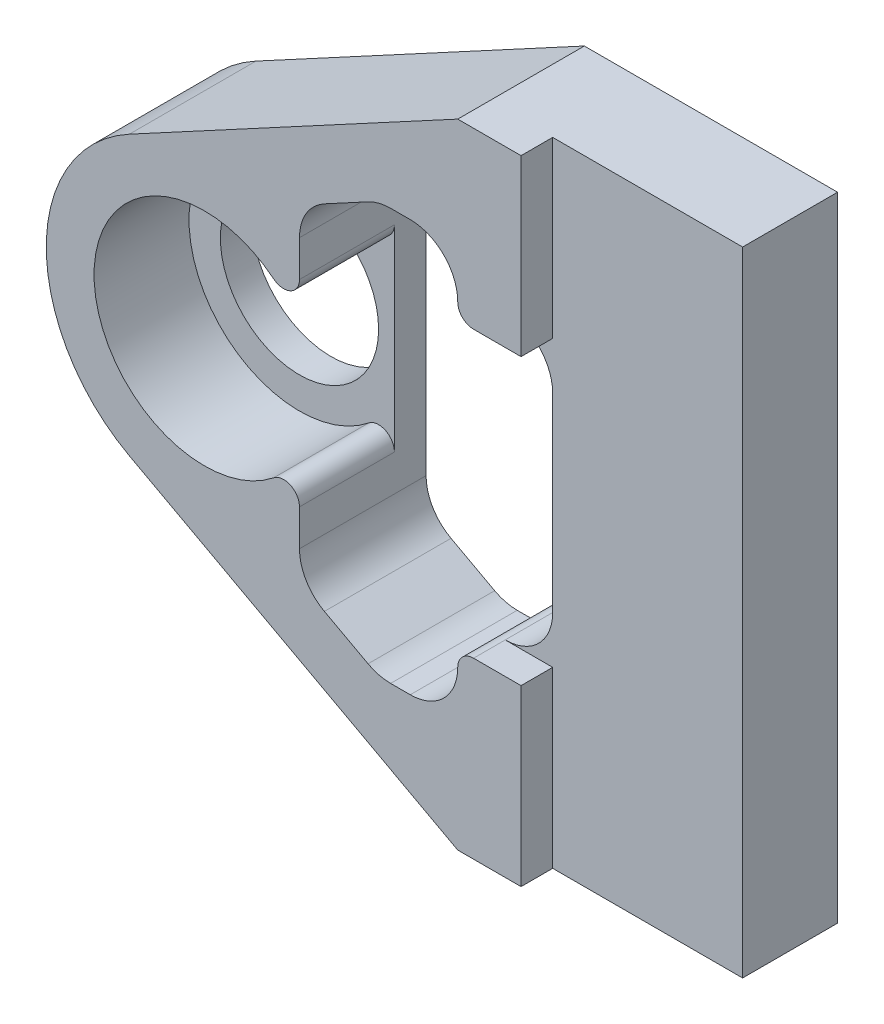
ISO-10303-21;
HEADER;
FILE_DESCRIPTION(('STEP AP214'),'2;1');
FILE_NAME('part.step','',(''),(''),'','','');
FILE_SCHEMA(('AUTOMOTIVE_DESIGN { 1 0 10303 214 1 1 1 1 }'));
ENDSEC;
DATA;
#1=APPLICATION_CONTEXT('core data for automotive mechanical design processes');
#2=APPLICATION_PROTOCOL_DEFINITION('international standard','automotive_design',2000,#1);
#3=PRODUCT_CONTEXT('',#1,'mechanical');
#4=PRODUCT('Part','Part','',(#3));
#5=PRODUCT_RELATED_PRODUCT_CATEGORY('part','',(#4));
#6=PRODUCT_DEFINITION_FORMATION('','',#4);
#7=PRODUCT_DEFINITION_CONTEXT('part definition',#1,'design');
#8=PRODUCT_DEFINITION('design','',#6,#7);
#9=PRODUCT_DEFINITION_SHAPE('','',#8);
#10=(LENGTH_UNIT() NAMED_UNIT(*) SI_UNIT(.MILLI.,.METRE.));
#11=(NAMED_UNIT(*) PLANE_ANGLE_UNIT() SI_UNIT($,.RADIAN.));
#12=(NAMED_UNIT(*) SI_UNIT($,.STERADIAN.) SOLID_ANGLE_UNIT());
#13=UNCERTAINTY_MEASURE_WITH_UNIT(LENGTH_MEASURE(1.E-05),#10,'distance_accuracy_value','');
#14=(GEOMETRIC_REPRESENTATION_CONTEXT(3) GLOBAL_UNCERTAINTY_ASSIGNED_CONTEXT((#13)) GLOBAL_UNIT_ASSIGNED_CONTEXT((#10,
#11,#12)) REPRESENTATION_CONTEXT('',''));
#15=CARTESIAN_POINT('',(0.,0.,0.));
#16=DIRECTION('',(0.,0.,1.));
#17=DIRECTION('',(1.,0.,0.));
#18=AXIS2_PLACEMENT_3D('',#15,#16,#17);
#19=CARTESIAN_POINT('',(10.,10.,3.));
#20=DIRECTION('',(-1.,0.,0.));
#21=DIRECTION('',(0.,-1.,0.));
#22=AXIS2_PLACEMENT_3D('',#19,#20,#21);
#23=PLANE('',#22);
#24=DIRECTION('',(0.,-1.,0.));
#25=VECTOR('',#24,1.);
#26=CARTESIAN_POINT('',(10.,10.,4.));
#27=LINE('',#26,#25);
#28=CARTESIAN_POINT('',(10.,10.,4.));
#29=VERTEX_POINT('',#28);
#30=CARTESIAN_POINT('',(10.,4.5,4.));
#31=VERTEX_POINT('',#30);
#32=EDGE_CURVE('E257',#29,#31,#27,.T.);
#33=ORIENTED_EDGE('',*,*,#32,.T.);
#34=DIRECTION('',(0.,0.,1.));
#35=VECTOR('',#34,1.);
#36=CARTESIAN_POINT('',(10.,4.5,-0.00100000000000013));
#37=LINE('',#36,#35);
#38=CARTESIAN_POINT('',(10.,4.5,3.));
#39=VERTEX_POINT('',#38);
#40=EDGE_CURVE('E250',#39,#31,#37,.T.);
#41=ORIENTED_EDGE('',*,*,#40,.F.);
#42=DIRECTION('',(0.,-1.,0.));
#43=VECTOR('',#42,1.);
#44=CARTESIAN_POINT('',(10.,10.,3.));
#45=LINE('',#44,#43);
#46=CARTESIAN_POINT('',(10.,10.,3.));
#47=VERTEX_POINT('',#46);
#48=EDGE_CURVE('E488',#47,#39,#45,.T.);
#49=ORIENTED_EDGE('',*,*,#48,.F.);
#50=DIRECTION('',(0.,0.,1.));
#51=VECTOR('',#50,1.);
#52=CARTESIAN_POINT('',(10.,10.,3.));
#53=LINE('',#52,#51);
#54=EDGE_CURVE('E271',#47,#29,#53,.T.);
#55=ORIENTED_EDGE('',*,*,#54,.T.);
#56=EDGE_LOOP('',(#33,#41,#49,#55));
#57=FACE_BOUND('',#56,.T.);
#58=ADVANCED_FACE('F33',(#57),#23,.F.);
#59=CARTESIAN_POINT('',(0.,0.,4.));
#60=DIRECTION('',(0.,0.,-1.));
#61=DIRECTION('',(-1.,0.,0.));
#62=AXIS2_PLACEMENT_3D('',#59,#60,#61);
#63=CYLINDRICAL_SURFACE('',#62,2.5);
#64=CARTESIAN_POINT('',(0.,0.,0.));
#65=DIRECTION('',(0.,0.,1.));
#66=DIRECTION('',(1.,0.,0.));
#67=AXIS2_PLACEMENT_3D('',#64,#65,#66);
#68=CIRCLE('',#67,2.5);
#69=CARTESIAN_POINT('',(2.5,0.,0.));
#70=VERTEX_POINT('',#69);
#71=EDGE_CURVE('E279',#70,#70,#68,.T.);
#72=ORIENTED_EDGE('',*,*,#71,.F.);
#73=EDGE_LOOP('',(#72));
#74=FACE_BOUND('',#73,.T.);
#75=CARTESIAN_POINT('',(0.,0.,1.));
#76=DIRECTION('',(0.,0.,1.));
#77=DIRECTION('',(1.,0.,0.));
#78=AXIS2_PLACEMENT_3D('',#75,#76,#77);
#79=CIRCLE('',#78,2.5);
#80=CARTESIAN_POINT('',(2.5,0.,1.));
#81=VERTEX_POINT('',#80);
#82=EDGE_CURVE('E276',#81,#81,#79,.T.);
#83=ORIENTED_EDGE('',*,*,#82,.T.);
#84=EDGE_LOOP('',(#83));
#85=FACE_BOUND('',#84,.T.);
#86=ADVANCED_FACE('F579',(#74,#85),#63,.F.);
#87=CARTESIAN_POINT('',(0.,0.,4.));
#88=DIRECTION('',(0.,0.,1.));
#89=DIRECTION('',(1.,0.,0.));
#90=AXIS2_PLACEMENT_3D('',#87,#88,#89);
#91=PLANE('',#90);
#92=DIRECTION('',(1.,0.,0.));
#93=VECTOR('',#92,1.);
#94=CARTESIAN_POINT('',(8.,-4.5,4.));
#95=LINE('',#94,#93);
#96=CARTESIAN_POINT('',(8.5,-4.5,4.));
#97=VERTEX_POINT('',#96);
#98=CARTESIAN_POINT('',(10.,-4.5,4.));
#99=VERTEX_POINT('',#98);
#100=EDGE_CURVE('E234',#97,#99,#95,.T.);
#101=ORIENTED_EDGE('',*,*,#100,.F.);
#102=CARTESIAN_POINT('',(8.5,-5.,4.));
#103=DIRECTION('',(0.,0.,1.));
#104=DIRECTION('',(1.,0.,0.));
#105=AXIS2_PLACEMENT_3D('',#102,#103,#104);
#106=CIRCLE('',#105,0.5);
#107=CARTESIAN_POINT('',(8.,-5.,4.));
#108=VERTEX_POINT('',#107);
#109=EDGE_CURVE('E425',#97,#108,#106,.T.);
#110=ORIENTED_EDGE('',*,*,#109,.T.);
#111=CARTESIAN_POINT('',(6.5,-5.,4.));
#112=DIRECTION('',(0.,0.,1.));
#113=DIRECTION('',(1.,0.,0.));
#114=AXIS2_PLACEMENT_3D('',#111,#112,#113);
#115=CIRCLE('',#114,1.5);
#116=CARTESIAN_POINT('',(6.5,-6.5,4.));
#117=VERTEX_POINT('',#116);
#118=EDGE_CURVE('E403',#108,#117,#115,.F.);
#119=ORIENTED_EDGE('',*,*,#118,.T.);
#120=DIRECTION('',(1.,0.,0.));
#121=VECTOR('',#120,1.);
#122=CARTESIAN_POINT('',(5.5,-6.5,4.));
#123=LINE('',#122,#121);
#124=CARTESIAN_POINT('',(5.87898261225516,-6.5,4.));
#125=VERTEX_POINT('',#124);
#126=EDGE_CURVE('E242',#125,#117,#123,.T.);
#127=ORIENTED_EDGE('',*,*,#126,.F.);
#128=CARTESIAN_POINT('',(5.87898261225516,-5.,4.));
#129=DIRECTION('',(0.,0.,1.));
#130=DIRECTION('',(1.,0.,0.));
#131=AXIS2_PLACEMENT_3D('',#128,#129,#130);
#132=CIRCLE('',#131,1.5);
#133=CARTESIAN_POINT('',(5.16649851568032,-6.31998727725987,4.));
#134=VERTEX_POINT('',#133);
#135=EDGE_CURVE('E407',#125,#134,#132,.F.);
#136=ORIENTED_EDGE('',*,*,#135,.T.);
#137=DIRECTION('',(0.879991518173249,-0.47498939771656,0.));
#138=VECTOR('',#137,1.);
#139=CARTESIAN_POINT('',(3.,-5.15058529568962,4.));
#140=LINE('',#139,#138);
#141=CARTESIAN_POINT('',(3.78751590342516,-5.57565951167369,4.));
#142=VERTEX_POINT('',#141);
#143=EDGE_CURVE('E471',#142,#134,#140,.T.);
#144=ORIENTED_EDGE('',*,*,#143,.F.);
#145=CARTESIAN_POINT('',(4.5,-4.25567223441382,4.));
#146=DIRECTION('',(0.,0.,1.));
#147=DIRECTION('',(1.,0.,0.));
#148=AXIS2_PLACEMENT_3D('',#145,#146,#147);
#149=CIRCLE('',#148,1.5);
#150=CARTESIAN_POINT('',(3.,-4.25567223441382,4.));
#151=VERTEX_POINT('',#150);
#152=EDGE_CURVE('E411',#142,#151,#149,.F.);
#153=ORIENTED_EDGE('',*,*,#152,.T.);
#154=DIRECTION('',(0.,-1.,0.));
#155=VECTOR('',#154,1.);
#156=CARTESIAN_POINT('',(3.,5.15058529568961,4.));
#157=LINE('',#156,#155);
#158=CARTESIAN_POINT('',(3.,-3.10967843996771,4.));
#159=VERTEX_POINT('',#158);
#160=EDGE_CURVE('E468',#159,#151,#157,.T.);
#161=ORIENTED_EDGE('',*,*,#160,.F.);
#162=CARTESIAN_POINT('',(2.5,-3.10967843996771,4.));
#163=DIRECTION('',(0.,0.,1.));
#164=DIRECTION('',(1.,0.,0.));
#165=AXIS2_PLACEMENT_3D('',#162,#163,#164);
#166=CIRCLE('',#165,0.5);
#167=CARTESIAN_POINT('',(2.18671679197995,-2.71999442493416,4.));
#168=VERTEX_POINT('',#167);
#169=EDGE_CURVE('E333',#159,#168,#166,.T.);
#170=ORIENTED_EDGE('',*,*,#169,.T.);
#171=CARTESIAN_POINT('',(0.,0.,4.));
#172=DIRECTION('',(0.,0.,1.));
#173=DIRECTION('',(1.,0.,0.));
#174=AXIS2_PLACEMENT_3D('',#171,#172,#173);
#175=CIRCLE('',#174,3.49);
#176=CARTESIAN_POINT('',(2.18671679197995,2.71999442493416,4.));
#177=VERTEX_POINT('',#176);
#178=EDGE_CURVE('E270',#177,#168,#175,.T.);
#179=ORIENTED_EDGE('',*,*,#178,.F.);
#180=CARTESIAN_POINT('',(2.5,3.10967843996771,4.));
#181=DIRECTION('',(0.,0.,1.));
#182=DIRECTION('',(1.,0.,0.));
#183=AXIS2_PLACEMENT_3D('',#180,#181,#182);
#184=CIRCLE('',#183,0.5);
#185=CARTESIAN_POINT('',(3.,3.10967843996771,4.));
#186=VERTEX_POINT('',#185);
#187=EDGE_CURVE('E330',#177,#186,#184,.T.);
#188=ORIENTED_EDGE('',*,*,#187,.T.);
#189=CARTESIAN_POINT('',(3.,4.25567223441382,4.));
#190=VERTEX_POINT('',#189);
#191=EDGE_CURVE('E469',#190,#186,#157,.T.);
#192=ORIENTED_EDGE('',*,*,#191,.F.);
#193=CARTESIAN_POINT('',(4.5,4.25567223441382,4.));
#194=DIRECTION('',(0.,0.,1.));
#195=DIRECTION('',(1.,0.,0.));
#196=AXIS2_PLACEMENT_3D('',#193,#194,#195);
#197=CIRCLE('',#196,1.5);
#198=CARTESIAN_POINT('',(3.78751590342516,5.57565951167369,4.));
#199=VERTEX_POINT('',#198);
#200=EDGE_CURVE('E419',#190,#199,#197,.F.);
#201=ORIENTED_EDGE('',*,*,#200,.T.);
#202=DIRECTION('',(-0.879991518173249,-0.474989397716561,0.));
#203=VECTOR('',#202,1.);
#204=CARTESIAN_POINT('',(3.,5.15058529568961,4.));
#205=LINE('',#204,#203);
#206=CARTESIAN_POINT('',(5.16649851568032,6.31998727725987,4.));
#207=VERTEX_POINT('',#206);
#208=EDGE_CURVE('E251',#207,#199,#205,.T.);
#209=ORIENTED_EDGE('',*,*,#208,.F.);
#210=CARTESIAN_POINT('',(5.87898261225516,5.,4.));
#211=DIRECTION('',(0.,0.,1.));
#212=DIRECTION('',(1.,0.,0.));
#213=AXIS2_PLACEMENT_3D('',#210,#211,#212);
#214=CIRCLE('',#213,1.5);
#215=CARTESIAN_POINT('',(5.87898261225516,6.5,4.));
#216=VERTEX_POINT('',#215);
#217=EDGE_CURVE('E415',#207,#216,#214,.F.);
#218=ORIENTED_EDGE('',*,*,#217,.T.);
#219=DIRECTION('',(-1.,0.,0.));
#220=VECTOR('',#219,1.);
#221=CARTESIAN_POINT('',(5.5,6.5,4.));
#222=LINE('',#221,#220);
#223=CARTESIAN_POINT('',(6.5,6.5,4.));
#224=VERTEX_POINT('',#223);
#225=EDGE_CURVE('E477',#224,#216,#222,.T.);
#226=ORIENTED_EDGE('',*,*,#225,.F.);
#227=CARTESIAN_POINT('',(6.5,5.,4.));
#228=DIRECTION('',(0.,0.,1.));
#229=DIRECTION('',(1.,0.,0.));
#230=AXIS2_PLACEMENT_3D('',#227,#228,#229);
#231=CIRCLE('',#230,1.5);
#232=CARTESIAN_POINT('',(8.,5.,4.));
#233=VERTEX_POINT('',#232);
#234=EDGE_CURVE('E399',#224,#233,#231,.F.);
#235=ORIENTED_EDGE('',*,*,#234,.T.);
#236=CARTESIAN_POINT('',(8.5,5.,4.));
#237=DIRECTION('',(0.,0.,1.));
#238=DIRECTION('',(1.,0.,0.));
#239=AXIS2_PLACEMENT_3D('',#236,#237,#238);
#240=CIRCLE('',#239,0.5);
#241=CARTESIAN_POINT('',(8.5,4.5,4.));
#242=VERTEX_POINT('',#241);
#243=EDGE_CURVE('E48',#233,#242,#240,.T.);
#244=ORIENTED_EDGE('',*,*,#243,.T.);
#245=DIRECTION('',(-1.,0.,0.));
#246=VECTOR('',#245,1.);
#247=CARTESIAN_POINT('',(10.,4.5,4.));
#248=LINE('',#247,#246);
#249=EDGE_CURVE('E241',#31,#242,#248,.T.);
#250=ORIENTED_EDGE('',*,*,#249,.F.);
#251=ORIENTED_EDGE('',*,*,#32,.F.);
#252=DIRECTION('',(-1.,0.,0.));
#253=VECTOR('',#252,1.);
#254=CARTESIAN_POINT('',(8.,10.,4.));
#255=LINE('',#254,#253);
#256=CARTESIAN_POINT('',(8.,10.,4.));
#257=VERTEX_POINT('',#256);
#258=EDGE_CURVE('E283',#29,#257,#255,.T.);
#259=ORIENTED_EDGE('',*,*,#258,.T.);
#260=DIRECTION('',(-0.879991518173249,-0.474989397716561,0.));
#261=VECTOR('',#260,1.);
#262=CARTESIAN_POINT('',(-2.3749469885828,4.39995759086624,4.));
#263=LINE('',#262,#261);
#264=CARTESIAN_POINT('',(-2.3749469885828,4.39995759086624,4.));
#265=VERTEX_POINT('',#264);
#266=EDGE_CURVE('E285',#257,#265,#263,.T.);
#267=ORIENTED_EDGE('',*,*,#266,.T.);
#268=CARTESIAN_POINT('',(0.,0.,4.));
#269=DIRECTION('',(0.,0.,1.));
#270=DIRECTION('',(1.,0.,0.));
#271=AXIS2_PLACEMENT_3D('',#268,#269,#270);
#272=CIRCLE('',#271,5.);
#273=CARTESIAN_POINT('',(-2.37494698858281,-4.39995759086624,4.));
#274=VERTEX_POINT('',#273);
#275=EDGE_CURVE('E288',#265,#274,#272,.T.);
#276=ORIENTED_EDGE('',*,*,#275,.T.);
#277=DIRECTION('',(0.879991518173248,-0.474989397716561,0.));
#278=VECTOR('',#277,1.);
#279=CARTESIAN_POINT('',(8.,-10.,4.));
#280=LINE('',#279,#278);
#281=CARTESIAN_POINT('',(8.,-10.,4.));
#282=VERTEX_POINT('',#281);
#283=EDGE_CURVE('E290',#274,#282,#280,.T.);
#284=ORIENTED_EDGE('',*,*,#283,.T.);
#285=DIRECTION('',(1.,0.,0.));
#286=VECTOR('',#285,1.);
#287=CARTESIAN_POINT('',(8.,-10.,4.));
#288=LINE('',#287,#286);
#289=CARTESIAN_POINT('',(10.,-10.,4.));
#290=VERTEX_POINT('',#289);
#291=EDGE_CURVE('E256',#282,#290,#288,.T.);
#292=ORIENTED_EDGE('',*,*,#291,.T.);
#293=EDGE_CURVE('E247',#99,#290,#27,.T.);
#294=ORIENTED_EDGE('',*,*,#293,.F.);
#295=EDGE_LOOP('',(#101,#110,#119,#127,#136,#144,#153,#161,#170,#179,#188,#192,#201,#209,#218,
#226,#235,#244,#250,#251,#259,#267,#276,#284,#292,#294));
#296=FACE_BOUND('',#295,.T.);
#297=ADVANCED_FACE('F254',(#296),#91,.T.);
#298=CARTESIAN_POINT('',(0.,0.,0.));
#299=DIRECTION('',(0.,0.,1.));
#300=DIRECTION('',(1.,0.,0.));
#301=AXIS2_PLACEMENT_3D('',#298,#299,#300);
#302=PLANE('',#301);
#303=CARTESIAN_POINT('',(6.5,-5.,0.));
#304=DIRECTION('',(0.,0.,1.));
#305=DIRECTION('',(1.,0.,0.));
#306=AXIS2_PLACEMENT_3D('',#303,#304,#305);
#307=CIRCLE('',#306,1.5);
#308=CARTESIAN_POINT('',(6.5,-6.5,0.));
#309=VERTEX_POINT('',#308);
#310=CARTESIAN_POINT('',(8.,-5.,0.));
#311=VERTEX_POINT('',#310);
#312=EDGE_CURVE('E405',#309,#311,#307,.T.);
#313=ORIENTED_EDGE('',*,*,#312,.T.);
#314=CARTESIAN_POINT('',(8.5,-5.,0.));
#315=DIRECTION('',(0.,0.,1.));
#316=DIRECTION('',(1.,0.,0.));
#317=AXIS2_PLACEMENT_3D('',#314,#315,#316);
#318=CIRCLE('',#317,0.5);
#319=CARTESIAN_POINT('',(8.5,-4.5,0.));
#320=VERTEX_POINT('',#319);
#321=EDGE_CURVE('E41',#311,#320,#318,.F.);
#322=ORIENTED_EDGE('',*,*,#321,.T.);
#323=CARTESIAN_POINT('',(8.5,-3.,0.));
#324=DIRECTION('',(0.,0.,1.));
#325=DIRECTION('',(1.,0.,0.));
#326=AXIS2_PLACEMENT_3D('',#323,#324,#325);
#327=CIRCLE('',#326,1.5);
#328=CARTESIAN_POINT('',(10.,-3.,0.));
#329=VERTEX_POINT('',#328);
#330=EDGE_CURVE('E393',#320,#329,#327,.T.);
#331=ORIENTED_EDGE('',*,*,#330,.T.);
#332=DIRECTION('',(0.,-1.,0.));
#333=VECTOR('',#332,1.);
#334=CARTESIAN_POINT('',(10.,-4.5,0.));
#335=LINE('',#334,#333);
#336=CARTESIAN_POINT('',(10.,3.,0.));
#337=VERTEX_POINT('',#336);
#338=EDGE_CURVE('E452',#337,#329,#335,.T.);
#339=ORIENTED_EDGE('',*,*,#338,.F.);
#340=CARTESIAN_POINT('',(8.5,3.,0.));
#341=DIRECTION('',(0.,0.,1.));
#342=DIRECTION('',(1.,0.,0.));
#343=AXIS2_PLACEMENT_3D('',#340,#341,#342);
#344=CIRCLE('',#343,1.5);
#345=CARTESIAN_POINT('',(8.5,4.5,0.));
#346=VERTEX_POINT('',#345);
#347=EDGE_CURVE('E397',#337,#346,#344,.T.);
#348=ORIENTED_EDGE('',*,*,#347,.T.);
#349=CARTESIAN_POINT('',(8.5,5.,0.));
#350=DIRECTION('',(0.,0.,1.));
#351=DIRECTION('',(1.,0.,0.));
#352=AXIS2_PLACEMENT_3D('',#349,#350,#351);
#353=CIRCLE('',#352,0.5);
#354=CARTESIAN_POINT('',(8.,5.,0.));
#355=VERTEX_POINT('',#354);
#356=EDGE_CURVE('E427',#346,#355,#353,.F.);
#357=ORIENTED_EDGE('',*,*,#356,.T.);
#358=CARTESIAN_POINT('',(6.5,5.,0.));
#359=DIRECTION('',(0.,0.,1.));
#360=DIRECTION('',(1.,0.,0.));
#361=AXIS2_PLACEMENT_3D('',#358,#359,#360);
#362=CIRCLE('',#361,1.5);
#363=CARTESIAN_POINT('',(6.5,6.5,0.));
#364=VERTEX_POINT('',#363);
#365=EDGE_CURVE('E401',#355,#364,#362,.T.);
#366=ORIENTED_EDGE('',*,*,#365,.T.);
#367=DIRECTION('',(1.,0.,0.));
#368=VECTOR('',#367,1.);
#369=CARTESIAN_POINT('',(5.5,6.5,0.));
#370=LINE('',#369,#368);
#371=CARTESIAN_POINT('',(5.87898261225516,6.5,0.));
#372=VERTEX_POINT('',#371);
#373=EDGE_CURVE('E454',#372,#364,#370,.T.);
#374=ORIENTED_EDGE('',*,*,#373,.F.);
#375=CARTESIAN_POINT('',(5.87898261225516,5.,0.));
#376=DIRECTION('',(0.,0.,1.));
#377=DIRECTION('',(1.,0.,0.));
#378=AXIS2_PLACEMENT_3D('',#375,#376,#377);
#379=CIRCLE('',#378,1.5);
#380=CARTESIAN_POINT('',(5.16649851568032,6.31998727725987,0.));
#381=VERTEX_POINT('',#380);
#382=EDGE_CURVE('E417',#372,#381,#379,.T.);
#383=ORIENTED_EDGE('',*,*,#382,.T.);
#384=DIRECTION('',(0.879991518173249,0.474989397716561,0.));
#385=VECTOR('',#384,1.);
#386=CARTESIAN_POINT('',(3.,5.15058529568961,0.));
#387=LINE('',#386,#385);
#388=CARTESIAN_POINT('',(3.78751590342516,5.57565951167369,0.));
#389=VERTEX_POINT('',#388);
#390=EDGE_CURVE('E458',#389,#381,#387,.T.);
#391=ORIENTED_EDGE('',*,*,#390,.F.);
#392=CARTESIAN_POINT('',(4.5,4.25567223441382,0.));
#393=DIRECTION('',(0.,0.,1.));
#394=DIRECTION('',(1.,0.,0.));
#395=AXIS2_PLACEMENT_3D('',#392,#393,#394);
#396=CIRCLE('',#395,1.5);
#397=CARTESIAN_POINT('',(3.,4.25567223441382,0.));
#398=VERTEX_POINT('',#397);
#399=EDGE_CURVE('E421',#389,#398,#396,.T.);
#400=ORIENTED_EDGE('',*,*,#399,.T.);
#401=DIRECTION('',(0.,1.,0.));
#402=VECTOR('',#401,1.);
#403=CARTESIAN_POINT('',(3.,5.15058529568961,0.));
#404=LINE('',#403,#402);
#405=CARTESIAN_POINT('',(3.,-4.25567223441382,0.));
#406=VERTEX_POINT('',#405);
#407=EDGE_CURVE('E465',#406,#398,#404,.T.);
#408=ORIENTED_EDGE('',*,*,#407,.F.);
#409=CARTESIAN_POINT('',(4.5,-4.25567223441382,0.));
#410=DIRECTION('',(0.,0.,1.));
#411=DIRECTION('',(1.,0.,0.));
#412=AXIS2_PLACEMENT_3D('',#409,#410,#411);
#413=CIRCLE('',#412,1.5);
#414=CARTESIAN_POINT('',(3.78751590342516,-5.57565951167369,0.));
#415=VERTEX_POINT('',#414);
#416=EDGE_CURVE('E413',#406,#415,#413,.T.);
#417=ORIENTED_EDGE('',*,*,#416,.T.);
#418=DIRECTION('',(-0.879991518173249,0.47498939771656,0.));
#419=VECTOR('',#418,1.);
#420=CARTESIAN_POINT('',(3.,-5.15058529568962,0.));
#421=LINE('',#420,#419);
#422=CARTESIAN_POINT('',(5.16649851568032,-6.31998727725987,0.));
#423=VERTEX_POINT('',#422);
#424=EDGE_CURVE('E262',#423,#415,#421,.T.);
#425=ORIENTED_EDGE('',*,*,#424,.F.);
#426=CARTESIAN_POINT('',(5.87898261225516,-5.,0.));
#427=DIRECTION('',(0.,0.,1.));
#428=DIRECTION('',(1.,0.,0.));
#429=AXIS2_PLACEMENT_3D('',#426,#427,#428);
#430=CIRCLE('',#429,1.5);
#431=CARTESIAN_POINT('',(5.87898261225516,-6.5,0.));
#432=VERTEX_POINT('',#431);
#433=EDGE_CURVE('E409',#423,#432,#430,.T.);
#434=ORIENTED_EDGE('',*,*,#433,.T.);
#435=DIRECTION('',(-1.,0.,0.));
#436=VECTOR('',#435,1.);
#437=CARTESIAN_POINT('',(5.5,-6.5,0.));
#438=LINE('',#437,#436);
#439=EDGE_CURVE('E455',#309,#432,#438,.T.);
#440=ORIENTED_EDGE('',*,*,#439,.F.);
#441=EDGE_LOOP('',(#313,#322,#331,#339,#348,#357,#366,#374,#383,#391,#400,#408,#417,#425,#434,#440));
#442=FACE_BOUND('',#441,.T.);
#443=DIRECTION('',(-1.,0.,0.));
#444=VECTOR('',#443,1.);
#445=CARTESIAN_POINT('',(8.,10.,0.));
#446=LINE('',#445,#444);
#447=CARTESIAN_POINT('',(16.,10.,0.));
#448=VERTEX_POINT('',#447);
#449=CARTESIAN_POINT('',(8.,10.,0.));
#450=VERTEX_POINT('',#449);
#451=EDGE_CURVE('E282',#448,#450,#446,.T.);
#452=ORIENTED_EDGE('',*,*,#451,.F.);
#453=DIRECTION('',(0.,1.,0.));
#454=VECTOR('',#453,1.);
#455=CARTESIAN_POINT('',(16.,-10.,0.));
#456=LINE('',#455,#454);
#457=CARTESIAN_POINT('',(16.,-10.,0.));
#458=VERTEX_POINT('',#457);
#459=EDGE_CURVE('E286',#458,#448,#456,.T.);
#460=ORIENTED_EDGE('',*,*,#459,.F.);
#461=DIRECTION('',(1.,0.,0.));
#462=VECTOR('',#461,1.);
#463=CARTESIAN_POINT('',(8.,-10.,0.));
#464=LINE('',#463,#462);
#465=CARTESIAN_POINT('',(8.,-10.,0.));
#466=VERTEX_POINT('',#465);
#467=EDGE_CURVE('E302',#466,#458,#464,.T.);
#468=ORIENTED_EDGE('',*,*,#467,.F.);
#469=DIRECTION('',(0.879991518173248,-0.474989397716561,0.));
#470=VECTOR('',#469,1.);
#471=CARTESIAN_POINT('',(8.,-10.,0.));
#472=LINE('',#471,#470);
#473=CARTESIAN_POINT('',(-2.37494698858281,-4.39995759086624,0.));
#474=VERTEX_POINT('',#473);
#475=EDGE_CURVE('E300',#474,#466,#472,.T.);
#476=ORIENTED_EDGE('',*,*,#475,.F.);
#477=CARTESIAN_POINT('',(0.,0.,0.));
#478=DIRECTION('',(0.,0.,1.));
#479=DIRECTION('',(1.,0.,0.));
#480=AXIS2_PLACEMENT_3D('',#477,#478,#479);
#481=CIRCLE('',#480,5.);
#482=CARTESIAN_POINT('',(-2.3749469885828,4.39995759086624,0.));
#483=VERTEX_POINT('',#482);
#484=EDGE_CURVE('E298',#483,#474,#481,.T.);
#485=ORIENTED_EDGE('',*,*,#484,.F.);
#486=DIRECTION('',(-0.879991518173249,-0.474989397716561,0.));
#487=VECTOR('',#486,1.);
#488=CARTESIAN_POINT('',(-2.3749469885828,4.39995759086624,0.));
#489=LINE('',#488,#487);
#490=EDGE_CURVE('E296',#450,#483,#489,.T.);
#491=ORIENTED_EDGE('',*,*,#490,.F.);
#492=EDGE_LOOP('',(#452,#460,#468,#476,#485,#491));
#493=FACE_BOUND('',#492,.T.);
#494=ORIENTED_EDGE('',*,*,#71,.T.);
#495=EDGE_LOOP('',(#494));
#496=FACE_BOUND('',#495,.T.);
#497=ADVANCED_FACE('F431',(#442,#493,#496),#302,.F.);
#498=CARTESIAN_POINT('',(8.,10.,4.));
#499=DIRECTION('',(0.,-1.,0.));
#500=DIRECTION('',(0.,0.,-1.));
#501=AXIS2_PLACEMENT_3D('',#498,#499,#500);
#502=PLANE('',#501);
#503=ORIENTED_EDGE('',*,*,#258,.F.);
#504=ORIENTED_EDGE('',*,*,#54,.F.);
#505=DIRECTION('',(-1.,0.,0.));
#506=VECTOR('',#505,1.);
#507=CARTESIAN_POINT('',(16.,10.,3.));
#508=LINE('',#507,#506);
#509=CARTESIAN_POINT('',(16.,10.,3.));
#510=VERTEX_POINT('',#509);
#511=EDGE_CURVE('E486',#510,#47,#508,.T.);
#512=ORIENTED_EDGE('',*,*,#511,.F.);
#513=DIRECTION('',(0.,0.,-1.));
#514=VECTOR('',#513,1.);
#515=CARTESIAN_POINT('',(16.,10.,4.));
#516=LINE('',#515,#514);
#517=EDGE_CURVE('E293',#510,#448,#516,.T.);
#518=ORIENTED_EDGE('',*,*,#517,.T.);
#519=ORIENTED_EDGE('',*,*,#451,.T.);
#520=DIRECTION('',(0.,0.,-1.));
#521=VECTOR('',#520,1.);
#522=CARTESIAN_POINT('',(8.,10.,4.));
#523=LINE('',#522,#521);
#524=EDGE_CURVE('E319',#257,#450,#523,.T.);
#525=ORIENTED_EDGE('',*,*,#524,.F.);
#526=EDGE_LOOP('',(#503,#504,#512,#518,#519,#525));
#527=FACE_BOUND('',#526,.T.);
#528=ADVANCED_FACE('F506',(#527),#502,.F.);
#529=CARTESIAN_POINT('',(-2.3749469885828,4.39995759086624,4.));
#530=DIRECTION('',(0.474989397716561,-0.879991518173249,0.));
#531=DIRECTION('',(0.879991518173249,0.474989397716561,0.));
#532=AXIS2_PLACEMENT_3D('',#529,#530,#531);
#533=PLANE('',#532);
#534=ORIENTED_EDGE('',*,*,#490,.T.);
#535=DIRECTION('',(0.,0.,-1.));
#536=VECTOR('',#535,1.);
#537=CARTESIAN_POINT('',(-2.3749469885828,4.39995759086624,4.));
#538=LINE('',#537,#536);
#539=EDGE_CURVE('E316',#265,#483,#538,.T.);
#540=ORIENTED_EDGE('',*,*,#539,.F.);
#541=ORIENTED_EDGE('',*,*,#266,.F.);
#542=ORIENTED_EDGE('',*,*,#524,.T.);
#543=EDGE_LOOP('',(#534,#540,#541,#542));
#544=FACE_BOUND('',#543,.T.);
#545=ADVANCED_FACE('F744',(#544),#533,.F.);
#546=CARTESIAN_POINT('',(0.,0.,4.));
#547=DIRECTION('',(0.,0.,-1.));
#548=DIRECTION('',(-1.,0.,0.));
#549=AXIS2_PLACEMENT_3D('',#546,#547,#548);
#550=CYLINDRICAL_SURFACE('',#549,5.);
#551=ORIENTED_EDGE('',*,*,#484,.T.);
#552=DIRECTION('',(0.,0.,-1.));
#553=VECTOR('',#552,1.);
#554=CARTESIAN_POINT('',(-2.37494698858281,-4.39995759086624,4.));
#555=LINE('',#554,#553);
#556=EDGE_CURVE('E313',#274,#474,#555,.T.);
#557=ORIENTED_EDGE('',*,*,#556,.F.);
#558=ORIENTED_EDGE('',*,*,#275,.F.);
#559=ORIENTED_EDGE('',*,*,#539,.T.);
#560=EDGE_LOOP('',(#551,#557,#558,#559));
#561=FACE_BOUND('',#560,.T.);
#562=ADVANCED_FACE('F747',(#561),#550,.T.);
#563=CARTESIAN_POINT('',(8.,-10.,4.));
#564=DIRECTION('',(0.474989397716561,0.879991518173249,0.));
#565=DIRECTION('',(-0.879991518173249,0.474989397716561,0.));
#566=AXIS2_PLACEMENT_3D('',#563,#564,#565);
#567=PLANE('',#566);
#568=ORIENTED_EDGE('',*,*,#475,.T.);
#569=DIRECTION('',(0.,0.,-1.));
#570=VECTOR('',#569,1.);
#571=CARTESIAN_POINT('',(8.,-10.,4.));
#572=LINE('',#571,#570);
#573=EDGE_CURVE('E310',#282,#466,#572,.T.);
#574=ORIENTED_EDGE('',*,*,#573,.F.);
#575=ORIENTED_EDGE('',*,*,#283,.F.);
#576=ORIENTED_EDGE('',*,*,#556,.T.);
#577=EDGE_LOOP('',(#568,#574,#575,#576));
#578=FACE_BOUND('',#577,.T.);
#579=ADVANCED_FACE('F751',(#578),#567,.F.);
#580=CARTESIAN_POINT('',(8.,-10.,4.));
#581=DIRECTION('',(0.,1.,0.));
#582=DIRECTION('',(0.,0.,1.));
#583=AXIS2_PLACEMENT_3D('',#580,#581,#582);
#584=PLANE('',#583);
#585=DIRECTION('',(1.,0.,0.));
#586=VECTOR('',#585,1.);
#587=CARTESIAN_POINT('',(16.,-10.,3.));
#588=LINE('',#587,#586);
#589=CARTESIAN_POINT('',(10.,-10.,3.));
#590=VERTEX_POINT('',#589);
#591=CARTESIAN_POINT('',(16.,-10.,3.));
#592=VERTEX_POINT('',#591);
#593=EDGE_CURVE('E266',#590,#592,#588,.T.);
#594=ORIENTED_EDGE('',*,*,#593,.F.);
#595=DIRECTION('',(0.,0.,1.));
#596=VECTOR('',#595,1.);
#597=CARTESIAN_POINT('',(10.,-10.,3.));
#598=LINE('',#597,#596);
#599=EDGE_CURVE('E268',#590,#290,#598,.T.);
#600=ORIENTED_EDGE('',*,*,#599,.T.);
#601=ORIENTED_EDGE('',*,*,#291,.F.);
#602=ORIENTED_EDGE('',*,*,#573,.T.);
#603=ORIENTED_EDGE('',*,*,#467,.T.);
#604=DIRECTION('',(0.,0.,-1.));
#605=VECTOR('',#604,1.);
#606=CARTESIAN_POINT('',(16.,-10.,4.));
#607=LINE('',#606,#605);
#608=EDGE_CURVE('E308',#592,#458,#607,.T.);
#609=ORIENTED_EDGE('',*,*,#608,.F.);
#610=EDGE_LOOP('',(#594,#600,#601,#602,#603,#609));
#611=FACE_BOUND('',#610,.T.);
#612=ADVANCED_FACE('F495',(#611),#584,.F.);
#613=CARTESIAN_POINT('',(16.,-10.,4.));
#614=DIRECTION('',(-1.,0.,0.));
#615=DIRECTION('',(0.,0.,1.));
#616=AXIS2_PLACEMENT_3D('',#613,#614,#615);
#617=PLANE('',#616);
#618=ORIENTED_EDGE('',*,*,#517,.F.);
#619=DIRECTION('',(0.,1.,0.));
#620=VECTOR('',#619,1.);
#621=CARTESIAN_POINT('',(16.,10.,3.));
#622=LINE('',#621,#620);
#623=EDGE_CURVE('E261',#592,#510,#622,.T.);
#624=ORIENTED_EDGE('',*,*,#623,.F.);
#625=ORIENTED_EDGE('',*,*,#608,.T.);
#626=ORIENTED_EDGE('',*,*,#459,.T.);
#627=EDGE_LOOP('',(#618,#624,#625,#626));
#628=FACE_BOUND('',#627,.T.);
#629=ADVANCED_FACE('F500',(#628),#617,.F.);
#630=CARTESIAN_POINT('',(0.,0.,1.));
#631=DIRECTION('',(0.,0.,1.));
#632=DIRECTION('',(1.,0.,0.));
#633=AXIS2_PLACEMENT_3D('',#630,#631,#632);
#634=CYLINDRICAL_SURFACE('',#633,3.49);
#635=ORIENTED_EDGE('',*,*,#178,.T.);
#636=DIRECTION('',(0.,0.,1.));
#637=VECTOR('',#636,1.);
#638=CARTESIAN_POINT('',(2.18671679197995,-2.71999442493416,1.));
#639=LINE('',#638,#637);
#640=CARTESIAN_POINT('',(2.18671679197995,-2.71999442493416,1.));
#641=VERTEX_POINT('',#640);
#642=EDGE_CURVE('E337',#168,#641,#639,.F.);
#643=ORIENTED_EDGE('',*,*,#642,.T.);
#644=CARTESIAN_POINT('',(0.,0.,1.));
#645=DIRECTION('',(0.,0.,1.));
#646=DIRECTION('',(1.,0.,0.));
#647=AXIS2_PLACEMENT_3D('',#644,#645,#646);
#648=CIRCLE('',#647,3.49);
#649=CARTESIAN_POINT('',(2.18671679197995,2.71999442493416,1.));
#650=VERTEX_POINT('',#649);
#651=EDGE_CURVE('E273',#650,#641,#648,.T.);
#652=ORIENTED_EDGE('',*,*,#651,.F.);
#653=DIRECTION('',(0.,0.,1.));
#654=VECTOR('',#653,1.);
#655=CARTESIAN_POINT('',(2.18671679197995,2.71999442493416,1.));
#656=LINE('',#655,#654);
#657=EDGE_CURVE('E335',#650,#177,#656,.T.);
#658=ORIENTED_EDGE('',*,*,#657,.T.);
#659=EDGE_LOOP('',(#635,#643,#652,#658));
#660=FACE_BOUND('',#659,.T.);
#661=ADVANCED_FACE('F567',(#660),#634,.F.);
#662=CARTESIAN_POINT('',(0.,0.,1.));
#663=DIRECTION('',(0.,0.,1.));
#664=DIRECTION('',(1.,0.,0.));
#665=AXIS2_PLACEMENT_3D('',#662,#663,#664);
#666=PLANE('',#665);
#667=DIRECTION('',(0.,1.,0.));
#668=VECTOR('',#667,1.);
#669=CARTESIAN_POINT('',(3.,5.15058529568961,1.));
#670=LINE('',#669,#668);
#671=CARTESIAN_POINT('',(3.,-3.10967843996771,1.));
#672=VERTEX_POINT('',#671);
#673=CARTESIAN_POINT('',(3.,3.10967843996771,1.));
#674=VERTEX_POINT('',#673);
#675=EDGE_CURVE('E258',#672,#674,#670,.T.);
#676=ORIENTED_EDGE('',*,*,#675,.T.);
#677=CARTESIAN_POINT('',(2.5,3.10967843996771,1.));
#678=DIRECTION('',(0.,0.,1.));
#679=DIRECTION('',(1.,0.,0.));
#680=AXIS2_PLACEMENT_3D('',#677,#678,#679);
#681=CIRCLE('',#680,0.5);
#682=EDGE_CURVE('E342',#674,#650,#681,.F.);
#683=ORIENTED_EDGE('',*,*,#682,.T.);
#684=ORIENTED_EDGE('',*,*,#651,.T.);
#685=CARTESIAN_POINT('',(2.5,-3.10967843996771,1.));
#686=DIRECTION('',(0.,0.,1.));
#687=DIRECTION('',(1.,0.,0.));
#688=AXIS2_PLACEMENT_3D('',#685,#686,#687);
#689=CIRCLE('',#688,0.5);
#690=EDGE_CURVE('E339',#641,#672,#689,.F.);
#691=ORIENTED_EDGE('',*,*,#690,.T.);
#692=EDGE_LOOP('',(#676,#683,#684,#691));
#693=FACE_BOUND('',#692,.T.);
#694=ORIENTED_EDGE('',*,*,#82,.F.);
#695=EDGE_LOOP('',(#694));
#696=FACE_BOUND('',#695,.T.);
#697=ADVANCED_FACE('F560',(#693,#696),#666,.T.);
#698=CARTESIAN_POINT('',(10.,-4.5,3.));
#699=VERTEX_POINT('',#698);
#700=EDGE_CURVE('E249',#699,#590,#45,.T.);
#701=ORIENTED_EDGE('',*,*,#700,.F.);
#702=DIRECTION('',(0.,0.,1.));
#703=VECTOR('',#702,1.);
#704=CARTESIAN_POINT('',(10.,-4.5,-0.00100000000000013));
#705=LINE('',#704,#703);
#706=EDGE_CURVE('E237',#699,#99,#705,.T.);
#707=ORIENTED_EDGE('',*,*,#706,.T.);
#708=ORIENTED_EDGE('',*,*,#293,.T.);
#709=ORIENTED_EDGE('',*,*,#599,.F.);
#710=EDGE_LOOP('',(#701,#707,#708,#709));
#711=FACE_BOUND('',#710,.T.);
#712=ADVANCED_FACE('F245',(#711),#23,.F.);
#713=CARTESIAN_POINT('',(0.,0.,3.));
#714=DIRECTION('',(0.,0.,-1.));
#715=DIRECTION('',(-1.,0.,0.));
#716=AXIS2_PLACEMENT_3D('',#713,#714,#715);
#717=PLANE('',#716);
#718=ORIENTED_EDGE('',*,*,#623,.T.);
#719=ORIENTED_EDGE('',*,*,#511,.T.);
#720=ORIENTED_EDGE('',*,*,#48,.T.);
#721=DIRECTION('',(1.,0.,0.));
#722=VECTOR('',#721,1.);
#723=CARTESIAN_POINT('',(0.,4.49999999999999,3.));
#724=LINE('',#723,#722);
#725=CARTESIAN_POINT('',(8.5,4.5,3.));
#726=VERTEX_POINT('',#725);
#727=EDGE_CURVE('E354',#726,#39,#724,.T.);
#728=ORIENTED_EDGE('',*,*,#727,.F.);
#729=CARTESIAN_POINT('',(8.5,3.,3.));
#730=DIRECTION('',(0.,0.,-1.));
#731=DIRECTION('',(-1.,0.,0.));
#732=AXIS2_PLACEMENT_3D('',#729,#730,#731);
#733=CIRCLE('',#732,1.5);
#734=CARTESIAN_POINT('',(10.,3.,3.));
#735=VERTEX_POINT('',#734);
#736=EDGE_CURVE('E395',#726,#735,#733,.T.);
#737=ORIENTED_EDGE('',*,*,#736,.T.);
#738=CARTESIAN_POINT('',(10.,-3.,3.));
#739=VERTEX_POINT('',#738);
#740=EDGE_CURVE('E448',#735,#739,#45,.T.);
#741=ORIENTED_EDGE('',*,*,#740,.T.);
#742=CARTESIAN_POINT('',(8.5,-3.,3.));
#743=DIRECTION('',(0.,0.,-1.));
#744=DIRECTION('',(-1.,0.,0.));
#745=AXIS2_PLACEMENT_3D('',#742,#743,#744);
#746=CIRCLE('',#745,1.5);
#747=CARTESIAN_POINT('',(8.5,-4.5,3.));
#748=VERTEX_POINT('',#747);
#749=EDGE_CURVE('E390',#739,#748,#746,.T.);
#750=ORIENTED_EDGE('',*,*,#749,.T.);
#751=DIRECTION('',(-1.,0.,0.));
#752=VECTOR('',#751,1.);
#753=CARTESIAN_POINT('',(0.,-4.5,3.));
#754=LINE('',#753,#752);
#755=EDGE_CURVE('E352',#699,#748,#754,.T.);
#756=ORIENTED_EDGE('',*,*,#755,.F.);
#757=ORIENTED_EDGE('',*,*,#700,.T.);
#758=ORIENTED_EDGE('',*,*,#593,.T.);
#759=EDGE_LOOP('',(#718,#719,#720,#728,#737,#741,#750,#756,#757,#758));
#760=FACE_BOUND('',#759,.T.);
#761=ADVANCED_FACE('F446',(#760),#717,.F.);
#762=CARTESIAN_POINT('',(10.,-4.5,-0.00100000000000013));
#763=DIRECTION('',(1.,0.,0.));
#764=DIRECTION('',(0.,1.,0.));
#765=AXIS2_PLACEMENT_3D('',#762,#763,#764);
#766=PLANE('',#765);
#767=ORIENTED_EDGE('',*,*,#338,.T.);
#768=DIRECTION('',(0.,0.,1.));
#769=VECTOR('',#768,1.);
#770=CARTESIAN_POINT('',(10.,-3.,3.));
#771=LINE('',#770,#769);
#772=EDGE_CURVE('E346',#329,#739,#771,.T.);
#773=ORIENTED_EDGE('',*,*,#772,.T.);
#774=ORIENTED_EDGE('',*,*,#740,.F.);
#775=DIRECTION('',(0.,0.,1.));
#776=VECTOR('',#775,1.);
#777=CARTESIAN_POINT('',(10.,3.,0.));
#778=LINE('',#777,#776);
#779=EDGE_CURVE('E344',#735,#337,#778,.F.);
#780=ORIENTED_EDGE('',*,*,#779,.T.);
#781=EDGE_LOOP('',(#767,#773,#774,#780));
#782=FACE_BOUND('',#781,.T.);
#783=ADVANCED_FACE('F450',(#782),#766,.F.);
#784=CARTESIAN_POINT('',(3.,5.15058529568961,-0.00100000000000013));
#785=DIRECTION('',(-1.,0.,0.));
#786=DIRECTION('',(0.,-1.,0.));
#787=AXIS2_PLACEMENT_3D('',#784,#785,#786);
#788=PLANE('',#787);
#789=ORIENTED_EDGE('',*,*,#160,.T.);
#790=DIRECTION('',(0.,0.,1.));
#791=VECTOR('',#790,1.);
#792=CARTESIAN_POINT('',(3.,-4.25567223441382,0.));
#793=LINE('',#792,#791);
#794=EDGE_CURVE('E383',#151,#406,#793,.F.);
#795=ORIENTED_EDGE('',*,*,#794,.T.);
#796=ORIENTED_EDGE('',*,*,#407,.T.);
#797=DIRECTION('',(0.,0.,1.));
#798=VECTOR('',#797,1.);
#799=CARTESIAN_POINT('',(3.,4.25567223441382,4.));
#800=LINE('',#799,#798);
#801=EDGE_CURVE('E380',#398,#190,#800,.T.);
#802=ORIENTED_EDGE('',*,*,#801,.T.);
#803=ORIENTED_EDGE('',*,*,#191,.T.);
#804=DIRECTION('',(0.,0.,1.));
#805=VECTOR('',#804,1.);
#806=CARTESIAN_POINT('',(3.,3.10967843996771,-0.00100000000000013));
#807=LINE('',#806,#805);
#808=EDGE_CURVE('E322',#186,#674,#807,.F.);
#809=ORIENTED_EDGE('',*,*,#808,.T.);
#810=ORIENTED_EDGE('',*,*,#675,.F.);
#811=DIRECTION('',(0.,0.,1.));
#812=VECTOR('',#811,1.);
#813=CARTESIAN_POINT('',(3.,-3.10967843996771,-0.00100000000000013));
#814=LINE('',#813,#812);
#815=EDGE_CURVE('E327',#672,#159,#814,.T.);
#816=ORIENTED_EDGE('',*,*,#815,.T.);
#817=EDGE_LOOP('',(#789,#795,#796,#802,#803,#809,#810,#816));
#818=FACE_BOUND('',#817,.T.);
#819=ADVANCED_FACE('F548',(#818),#788,.F.);
#820=CARTESIAN_POINT('',(3.,5.15058529568961,-0.00100000000000013));
#821=DIRECTION('',(-0.474989397716561,0.879991518173249,0.));
#822=DIRECTION('',(-0.879991518173249,-0.474989397716561,0.));
#823=AXIS2_PLACEMENT_3D('',#820,#821,#822);
#824=PLANE('',#823);
#825=ORIENTED_EDGE('',*,*,#390,.T.);
#826=DIRECTION('',(0.,0.,1.));
#827=VECTOR('',#826,1.);
#828=CARTESIAN_POINT('',(5.16649851568032,6.31998727725987,4.));
#829=LINE('',#828,#827);
#830=EDGE_CURVE('E387',#381,#207,#829,.T.);
#831=ORIENTED_EDGE('',*,*,#830,.T.);
#832=ORIENTED_EDGE('',*,*,#208,.T.);
#833=DIRECTION('',(0.,0.,1.));
#834=VECTOR('',#833,1.);
#835=CARTESIAN_POINT('',(3.78751590342516,5.57565951167369,0.));
#836=LINE('',#835,#834);
#837=EDGE_CURVE('E385',#199,#389,#836,.F.);
#838=ORIENTED_EDGE('',*,*,#837,.T.);
#839=EDGE_LOOP('',(#825,#831,#832,#838));
#840=FACE_BOUND('',#839,.T.);
#841=ADVANCED_FACE('F537',(#840),#824,.F.);
#842=CARTESIAN_POINT('',(5.5,6.5,-0.00100000000000013));
#843=DIRECTION('',(0.,1.,0.));
#844=DIRECTION('',(-1.,0.,0.));
#845=AXIS2_PLACEMENT_3D('',#842,#843,#844);
#846=PLANE('',#845);
#847=ORIENTED_EDGE('',*,*,#373,.T.);
#848=DIRECTION('',(0.,0.,1.));
#849=VECTOR('',#848,1.);
#850=CARTESIAN_POINT('',(6.5,6.5,4.));
#851=LINE('',#850,#849);
#852=EDGE_CURVE('E361',#364,#224,#851,.T.);
#853=ORIENTED_EDGE('',*,*,#852,.T.);
#854=ORIENTED_EDGE('',*,*,#225,.T.);
#855=DIRECTION('',(0.,0.,1.));
#856=VECTOR('',#855,1.);
#857=CARTESIAN_POINT('',(5.87898261225516,6.5,0.));
#858=LINE('',#857,#856);
#859=EDGE_CURVE('E359',#216,#372,#858,.F.);
#860=ORIENTED_EDGE('',*,*,#859,.T.);
#861=EDGE_LOOP('',(#847,#853,#854,#860));
#862=FACE_BOUND('',#861,.T.);
#863=ADVANCED_FACE('F529',(#862),#846,.F.);
#864=CARTESIAN_POINT('',(10.,4.5,-0.00100000000000013));
#865=DIRECTION('',(0.,1.,0.));
#866=DIRECTION('',(-1.,0.,0.));
#867=AXIS2_PLACEMENT_3D('',#864,#865,#866);
#868=PLANE('',#867);
#869=ORIENTED_EDGE('',*,*,#249,.T.);
#870=DIRECTION('',(0.,0.,1.));
#871=VECTOR('',#870,1.);
#872=CARTESIAN_POINT('',(8.5,4.5,-0.00100000000000013));
#873=LINE('',#872,#871);
#874=EDGE_CURVE('E11',#242,#726,#873,.F.);
#875=ORIENTED_EDGE('',*,*,#874,.T.);
#876=ORIENTED_EDGE('',*,*,#727,.T.);
#877=ORIENTED_EDGE('',*,*,#40,.T.);
#878=EDGE_LOOP('',(#869,#875,#876,#877));
#879=FACE_BOUND('',#878,.T.);
#880=ADVANCED_FACE('F514',(#879),#868,.F.);
#881=CARTESIAN_POINT('',(8.,-4.5,-0.00100000000000013));
#882=DIRECTION('',(0.,-1.,0.));
#883=DIRECTION('',(0.,0.,-1.));
#884=AXIS2_PLACEMENT_3D('',#881,#882,#883);
#885=PLANE('',#884);
#886=ORIENTED_EDGE('',*,*,#755,.T.);
#887=DIRECTION('',(0.,0.,1.));
#888=VECTOR('',#887,1.);
#889=CARTESIAN_POINT('',(8.5,-4.5,-0.00100000000000013));
#890=LINE('',#889,#888);
#891=EDGE_CURVE('E56',#748,#97,#890,.T.);
#892=ORIENTED_EDGE('',*,*,#891,.T.);
#893=ORIENTED_EDGE('',*,*,#100,.T.);
#894=ORIENTED_EDGE('',*,*,#706,.F.);
#895=EDGE_LOOP('',(#886,#892,#893,#894));
#896=FACE_BOUND('',#895,.T.);
#897=ADVANCED_FACE('F236',(#896),#885,.F.);
#898=CARTESIAN_POINT('',(5.5,-6.5,-0.00100000000000013));
#899=DIRECTION('',(0.,-1.,0.));
#900=DIRECTION('',(0.,0.,-1.));
#901=AXIS2_PLACEMENT_3D('',#898,#899,#900);
#902=PLANE('',#901);
#903=ORIENTED_EDGE('',*,*,#126,.T.);
#904=DIRECTION('',(0.,0.,1.));
#905=VECTOR('',#904,1.);
#906=CARTESIAN_POINT('',(6.5,-6.5,0.));
#907=LINE('',#906,#905);
#908=EDGE_CURVE('E373',#117,#309,#907,.F.);
#909=ORIENTED_EDGE('',*,*,#908,.T.);
#910=ORIENTED_EDGE('',*,*,#439,.T.);
#911=DIRECTION('',(0.,0.,1.));
#912=VECTOR('',#911,1.);
#913=CARTESIAN_POINT('',(5.87898261225516,-6.5,4.));
#914=LINE('',#913,#912);
#915=EDGE_CURVE('E370',#432,#125,#914,.T.);
#916=ORIENTED_EDGE('',*,*,#915,.T.);
#917=EDGE_LOOP('',(#903,#909,#910,#916));
#918=FACE_BOUND('',#917,.T.);
#919=ADVANCED_FACE('F602',(#918),#902,.F.);
#920=CARTESIAN_POINT('',(3.,-5.15058529568962,-0.00100000000000013));
#921=DIRECTION('',(-0.47498939771656,-0.879991518173249,0.));
#922=DIRECTION('',(0.879991518173249,-0.47498939771656,0.));
#923=AXIS2_PLACEMENT_3D('',#920,#921,#922);
#924=PLANE('',#923);
#925=ORIENTED_EDGE('',*,*,#143,.T.);
#926=DIRECTION('',(0.,0.,1.));
#927=VECTOR('',#926,1.);
#928=CARTESIAN_POINT('',(5.16649851568032,-6.31998727725987,0.));
#929=LINE('',#928,#927);
#930=EDGE_CURVE('E378',#134,#423,#929,.F.);
#931=ORIENTED_EDGE('',*,*,#930,.T.);
#932=ORIENTED_EDGE('',*,*,#424,.T.);
#933=DIRECTION('',(0.,0.,1.));
#934=VECTOR('',#933,1.);
#935=CARTESIAN_POINT('',(3.78751590342516,-5.57565951167369,4.));
#936=LINE('',#935,#934);
#937=EDGE_CURVE('E375',#415,#142,#936,.T.);
#938=ORIENTED_EDGE('',*,*,#937,.T.);
#939=EDGE_LOOP('',(#925,#931,#932,#938));
#940=FACE_BOUND('',#939,.T.);
#941=ADVANCED_FACE('F599',(#940),#924,.F.);
#942=CARTESIAN_POINT('',(2.5,-3.10967843996771,1.));
#943=DIRECTION('',(0.,0.,1.));
#944=DIRECTION('',(1.,0.,0.));
#945=AXIS2_PLACEMENT_3D('',#942,#943,#944);
#946=CYLINDRICAL_SURFACE('',#945,0.5);
#947=ORIENTED_EDGE('',*,*,#690,.F.);
#948=ORIENTED_EDGE('',*,*,#642,.F.);
#949=ORIENTED_EDGE('',*,*,#169,.F.);
#950=ORIENTED_EDGE('',*,*,#815,.F.);
#951=EDGE_LOOP('',(#947,#948,#949,#950));
#952=FACE_BOUND('',#951,.T.);
#953=ADVANCED_FACE('F565',(#952),#946,.T.);
#954=CARTESIAN_POINT('',(2.5,3.10967843996771,1.));
#955=DIRECTION('',(0.,0.,1.));
#956=DIRECTION('',(1.,0.,0.));
#957=AXIS2_PLACEMENT_3D('',#954,#955,#956);
#958=CYLINDRICAL_SURFACE('',#957,0.5);
#959=ORIENTED_EDGE('',*,*,#187,.F.);
#960=ORIENTED_EDGE('',*,*,#657,.F.);
#961=ORIENTED_EDGE('',*,*,#682,.F.);
#962=ORIENTED_EDGE('',*,*,#808,.F.);
#963=EDGE_LOOP('',(#959,#960,#961,#962));
#964=FACE_BOUND('',#963,.T.);
#965=ADVANCED_FACE('F555',(#964),#958,.T.);
#966=CARTESIAN_POINT('',(8.5,-3.,-0.00100000000000013));
#967=DIRECTION('',(0.,0.,-1.));
#968=DIRECTION('',(-1.,0.,0.));
#969=AXIS2_PLACEMENT_3D('',#966,#967,#968);
#970=CYLINDRICAL_SURFACE('',#969,1.5);
#971=ORIENTED_EDGE('',*,*,#330,.F.);
#972=DIRECTION('',(0.,0.,1.));
#973=VECTOR('',#972,1.);
#974=CARTESIAN_POINT('',(8.5,-4.5,0.));
#975=LINE('',#974,#973);
#976=EDGE_CURVE('E349',#748,#320,#975,.F.);
#977=ORIENTED_EDGE('',*,*,#976,.F.);
#978=ORIENTED_EDGE('',*,*,#749,.F.);
#979=ORIENTED_EDGE('',*,*,#772,.F.);
#980=EDGE_LOOP('',(#971,#977,#978,#979));
#981=FACE_BOUND('',#980,.T.);
#982=ADVANCED_FACE('F442',(#981),#970,.F.);
#983=CARTESIAN_POINT('',(8.5,3.,-0.00100000000000013));
#984=DIRECTION('',(0.,0.,-1.));
#985=DIRECTION('',(-1.,0.,0.));
#986=AXIS2_PLACEMENT_3D('',#983,#984,#985);
#987=CYLINDRICAL_SURFACE('',#986,1.5);
#988=ORIENTED_EDGE('',*,*,#347,.F.);
#989=ORIENTED_EDGE('',*,*,#779,.F.);
#990=ORIENTED_EDGE('',*,*,#736,.F.);
#991=DIRECTION('',(0.,0.,1.));
#992=VECTOR('',#991,1.);
#993=CARTESIAN_POINT('',(8.5,4.5,3.));
#994=LINE('',#993,#992);
#995=EDGE_CURVE('E356',#346,#726,#994,.T.);
#996=ORIENTED_EDGE('',*,*,#995,.F.);
#997=EDGE_LOOP('',(#988,#989,#990,#996));
#998=FACE_BOUND('',#997,.T.);
#999=ADVANCED_FACE('F520',(#998),#987,.F.);
#1000=CARTESIAN_POINT('',(6.5,5.,-0.00100000000000013));
#1001=DIRECTION('',(0.,0.,-1.));
#1002=DIRECTION('',(-1.,0.,0.));
#1003=AXIS2_PLACEMENT_3D('',#1000,#1001,#1002);
#1004=CYLINDRICAL_SURFACE('',#1003,1.5);
#1005=ORIENTED_EDGE('',*,*,#365,.F.);
#1006=DIRECTION('',(0.,0.,1.));
#1007=VECTOR('',#1006,1.);
#1008=CARTESIAN_POINT('',(8.,5.,0.));
#1009=LINE('',#1008,#1007);
#1010=EDGE_CURVE('E364',#233,#355,#1009,.F.);
#1011=ORIENTED_EDGE('',*,*,#1010,.F.);
#1012=ORIENTED_EDGE('',*,*,#234,.F.);
#1013=ORIENTED_EDGE('',*,*,#852,.F.);
#1014=EDGE_LOOP('',(#1005,#1011,#1012,#1013));
#1015=FACE_BOUND('',#1014,.T.);
#1016=ADVANCED_FACE('F526',(#1015),#1004,.F.);
#1017=CARTESIAN_POINT('',(6.5,-5.,-0.00100000000000013));
#1018=DIRECTION('',(0.,0.,-1.));
#1019=DIRECTION('',(-1.,0.,0.));
#1020=AXIS2_PLACEMENT_3D('',#1017,#1018,#1019);
#1021=CYLINDRICAL_SURFACE('',#1020,1.5);
#1022=ORIENTED_EDGE('',*,*,#312,.F.);
#1023=ORIENTED_EDGE('',*,*,#908,.F.);
#1024=ORIENTED_EDGE('',*,*,#118,.F.);
#1025=DIRECTION('',(0.,0.,1.));
#1026=VECTOR('',#1025,1.);
#1027=CARTESIAN_POINT('',(8.,-5.,4.));
#1028=LINE('',#1027,#1026);
#1029=EDGE_CURVE('E367',#311,#108,#1028,.T.);
#1030=ORIENTED_EDGE('',*,*,#1029,.F.);
#1031=EDGE_LOOP('',(#1022,#1023,#1024,#1030));
#1032=FACE_BOUND('',#1031,.T.);
#1033=ADVANCED_FACE('F678',(#1032),#1021,.F.);
#1034=CARTESIAN_POINT('',(5.87898261225516,-5.,-0.00100000000000013));
#1035=DIRECTION('',(0.,0.,-1.));
#1036=DIRECTION('',(-1.,0.,0.));
#1037=AXIS2_PLACEMENT_3D('',#1034,#1035,#1036);
#1038=CYLINDRICAL_SURFACE('',#1037,1.5);
#1039=ORIENTED_EDGE('',*,*,#433,.F.);
#1040=ORIENTED_EDGE('',*,*,#930,.F.);
#1041=ORIENTED_EDGE('',*,*,#135,.F.);
#1042=ORIENTED_EDGE('',*,*,#915,.F.);
#1043=EDGE_LOOP('',(#1039,#1040,#1041,#1042));
#1044=FACE_BOUND('',#1043,.T.);
#1045=ADVANCED_FACE('F687',(#1044),#1038,.F.);
#1046=CARTESIAN_POINT('',(4.5,-4.25567223441382,-0.00100000000000013));
#1047=DIRECTION('',(0.,0.,-1.));
#1048=DIRECTION('',(-1.,0.,0.));
#1049=AXIS2_PLACEMENT_3D('',#1046,#1047,#1048);
#1050=CYLINDRICAL_SURFACE('',#1049,1.5);
#1051=ORIENTED_EDGE('',*,*,#416,.F.);
#1052=ORIENTED_EDGE('',*,*,#794,.F.);
#1053=ORIENTED_EDGE('',*,*,#152,.F.);
#1054=ORIENTED_EDGE('',*,*,#937,.F.);
#1055=EDGE_LOOP('',(#1051,#1052,#1053,#1054));
#1056=FACE_BOUND('',#1055,.T.);
#1057=ADVANCED_FACE('F697',(#1056),#1050,.F.);
#1058=CARTESIAN_POINT('',(5.87898261225516,5.,-0.00100000000000013));
#1059=DIRECTION('',(0.,0.,-1.));
#1060=DIRECTION('',(-1.,0.,0.));
#1061=AXIS2_PLACEMENT_3D('',#1058,#1059,#1060);
#1062=CYLINDRICAL_SURFACE('',#1061,1.5);
#1063=ORIENTED_EDGE('',*,*,#382,.F.);
#1064=ORIENTED_EDGE('',*,*,#859,.F.);
#1065=ORIENTED_EDGE('',*,*,#217,.F.);
#1066=ORIENTED_EDGE('',*,*,#830,.F.);
#1067=EDGE_LOOP('',(#1063,#1064,#1065,#1066));
#1068=FACE_BOUND('',#1067,.T.);
#1069=ADVANCED_FACE('F535',(#1068),#1062,.F.);
#1070=CARTESIAN_POINT('',(4.5,4.25567223441382,-0.00100000000000013));
#1071=DIRECTION('',(0.,0.,-1.));
#1072=DIRECTION('',(-1.,0.,0.));
#1073=AXIS2_PLACEMENT_3D('',#1070,#1071,#1072);
#1074=CYLINDRICAL_SURFACE('',#1073,1.5);
#1075=ORIENTED_EDGE('',*,*,#399,.F.);
#1076=ORIENTED_EDGE('',*,*,#837,.F.);
#1077=ORIENTED_EDGE('',*,*,#200,.F.);
#1078=ORIENTED_EDGE('',*,*,#801,.F.);
#1079=EDGE_LOOP('',(#1075,#1076,#1077,#1078));
#1080=FACE_BOUND('',#1079,.T.);
#1081=ADVANCED_FACE('F544',(#1080),#1074,.F.);
#1082=CARTESIAN_POINT('',(8.5,-5.,-0.00100000000000013));
#1083=DIRECTION('',(0.,0.,1.));
#1084=DIRECTION('',(1.,0.,0.));
#1085=AXIS2_PLACEMENT_3D('',#1082,#1083,#1084);
#1086=CYLINDRICAL_SURFACE('',#1085,0.5);
#1087=ORIENTED_EDGE('',*,*,#321,.F.);
#1088=ORIENTED_EDGE('',*,*,#1029,.T.);
#1089=ORIENTED_EDGE('',*,*,#109,.F.);
#1090=ORIENTED_EDGE('',*,*,#891,.F.);
#1091=ORIENTED_EDGE('',*,*,#976,.T.);
#1092=EDGE_LOOP('',(#1087,#1088,#1089,#1090,#1091));
#1093=FACE_BOUND('',#1092,.T.);
#1094=ADVANCED_FACE('F443',(#1093),#1086,.T.);
#1095=CARTESIAN_POINT('',(8.5,5.,-0.00100000000000013));
#1096=DIRECTION('',(0.,0.,1.));
#1097=DIRECTION('',(1.,0.,0.));
#1098=AXIS2_PLACEMENT_3D('',#1095,#1096,#1097);
#1099=CYLINDRICAL_SURFACE('',#1098,0.5);
#1100=ORIENTED_EDGE('',*,*,#995,.T.);
#1101=ORIENTED_EDGE('',*,*,#874,.F.);
#1102=ORIENTED_EDGE('',*,*,#243,.F.);
#1103=ORIENTED_EDGE('',*,*,#1010,.T.);
#1104=ORIENTED_EDGE('',*,*,#356,.F.);
#1105=EDGE_LOOP('',(#1100,#1101,#1102,#1103,#1104));
#1106=FACE_BOUND('',#1105,.T.);
#1107=ADVANCED_FACE('F35',(#1106),#1099,.T.);
#1108=CLOSED_SHELL('',(#58,#86,#297,#497,#528,#545,#562,#579,#612,#629,#661,#697,#712,#761,#783,
#819,#841,#863,#880,#897,#919,#941,#953,#965,#982,#999,#1016,#1033,#1045,#1057,#1069,#1081,
#1094,#1107));
#1109=MANIFOLD_SOLID_BREP('B2',#1108);
#1110=ADVANCED_BREP_SHAPE_REPRESENTATION('',(#18,#1109),#14);
#1111=SHAPE_DEFINITION_REPRESENTATION(#9,#1110);
ENDSEC;
END-ISO-10303-21;
